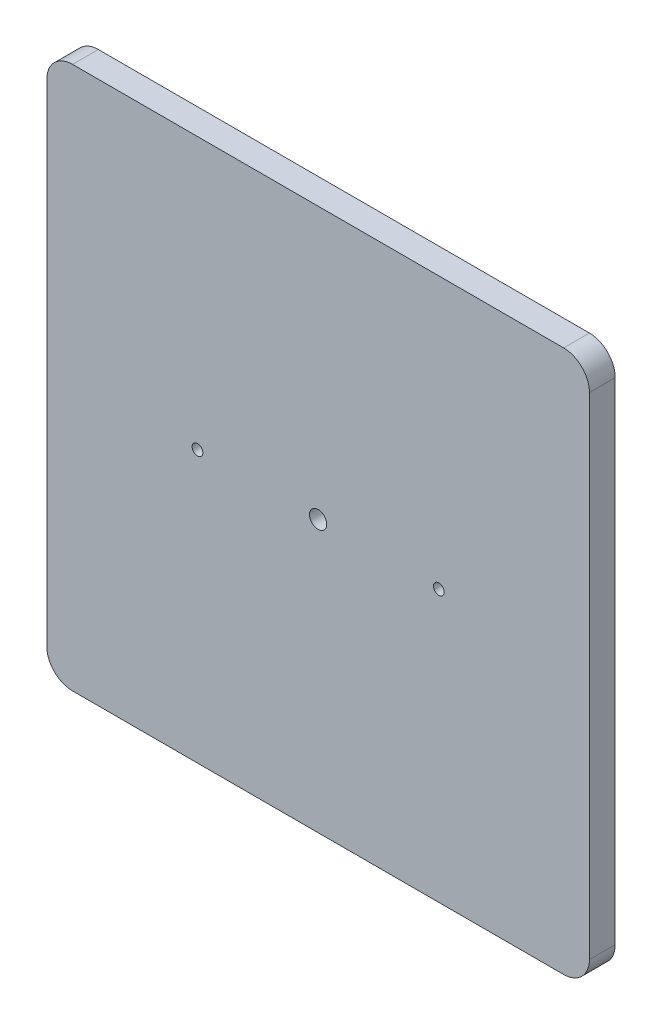
ISO-10303-21;
HEADER;
FILE_DESCRIPTION(('STEP AP214'),'2;1');
FILE_NAME('part.step','',(''),(''),'','','');
FILE_SCHEMA(('AUTOMOTIVE_DESIGN { 1 0 10303 214 1 1 1 1 }'));
ENDSEC;
DATA;
#1=APPLICATION_CONTEXT('core data for automotive mechanical design processes');
#2=APPLICATION_PROTOCOL_DEFINITION('international standard','automotive_design',2000,#1);
#3=PRODUCT_CONTEXT('',#1,'mechanical');
#4=PRODUCT('Part','Part','',(#3));
#5=PRODUCT_RELATED_PRODUCT_CATEGORY('part','',(#4));
#6=PRODUCT_DEFINITION_FORMATION('','',#4);
#7=PRODUCT_DEFINITION_CONTEXT('part definition',#1,'design');
#8=PRODUCT_DEFINITION('design','',#6,#7);
#9=PRODUCT_DEFINITION_SHAPE('','',#8);
#10=(LENGTH_UNIT() NAMED_UNIT(*) SI_UNIT(.MILLI.,.METRE.));
#11=(NAMED_UNIT(*) PLANE_ANGLE_UNIT() SI_UNIT($,.RADIAN.));
#12=(NAMED_UNIT(*) SI_UNIT($,.STERADIAN.) SOLID_ANGLE_UNIT());
#13=UNCERTAINTY_MEASURE_WITH_UNIT(LENGTH_MEASURE(1.E-05),#10,'distance_accuracy_value','');
#14=(GEOMETRIC_REPRESENTATION_CONTEXT(3) GLOBAL_UNCERTAINTY_ASSIGNED_CONTEXT((#13)) GLOBAL_UNIT_ASSIGNED_CONTEXT((#10,
#11,#12)) REPRESENTATION_CONTEXT('',''));
#15=CARTESIAN_POINT('',(0.,0.,0.));
#16=DIRECTION('',(0.,0.,1.));
#17=DIRECTION('',(1.,0.,0.));
#18=AXIS2_PLACEMENT_3D('',#15,#16,#17);
#19=CARTESIAN_POINT('',(0.,0.,0.));
#20=DIRECTION('',(0.,0.,1.));
#21=DIRECTION('',(1.,0.,0.));
#22=AXIS2_PLACEMENT_3D('',#19,#20,#21);
#23=PLANE('',#22);
#24=CARTESIAN_POINT('',(44.5,0.,0.));
#25=DIRECTION('',(0.,0.,-1.));
#26=DIRECTION('',(-1.,0.,0.));
#27=AXIS2_PLACEMENT_3D('',#24,#25,#26);
#28=CIRCLE('',#27,2.619375);
#29=CARTESIAN_POINT('',(41.880625,0.,0.));
#30=VERTEX_POINT('',#29);
#31=EDGE_CURVE('E206',#30,#30,#28,.T.);
#32=ORIENTED_EDGE('',*,*,#31,.F.);
#33=EDGE_LOOP('',(#32));
#34=FACE_BOUND('',#33,.T.);
#35=CARTESIAN_POINT('',(0.,0.,0.));
#36=DIRECTION('',(0.,0.,-1.));
#37=DIRECTION('',(-1.,0.,0.));
#38=AXIS2_PLACEMENT_3D('',#35,#36,#37);
#39=CIRCLE('',#38,3.81);
#40=CARTESIAN_POINT('',(-3.81,0.,0.));
#41=VERTEX_POINT('',#40);
#42=EDGE_CURVE('E188',#41,#41,#39,.T.);
#43=ORIENTED_EDGE('',*,*,#42,.F.);
#44=EDGE_LOOP('',(#43));
#45=FACE_BOUND('',#44,.T.);
#46=DIRECTION('',(1.,0.,0.));
#47=VECTOR('',#46,1.);
#48=CARTESIAN_POINT('',(-100.,-100.,0.));
#49=LINE('',#48,#47);
#50=CARTESIAN_POINT('',(-90.5,-100.,0.));
#51=VERTEX_POINT('',#50);
#52=CARTESIAN_POINT('',(90.5,-100.,0.));
#53=VERTEX_POINT('',#52);
#54=EDGE_CURVE('E128',#51,#53,#49,.T.);
#55=ORIENTED_EDGE('',*,*,#54,.F.);
#56=CARTESIAN_POINT('',(-90.5,-90.5,0.));
#57=DIRECTION('',(0.,0.,1.));
#58=DIRECTION('',(1.,0.,0.));
#59=AXIS2_PLACEMENT_3D('',#56,#57,#58);
#60=CIRCLE('',#59,9.5);
#61=CARTESIAN_POINT('',(-100.,-90.5,0.));
#62=VERTEX_POINT('',#61);
#63=EDGE_CURVE('E111',#51,#62,#60,.F.);
#64=ORIENTED_EDGE('',*,*,#63,.T.);
#65=DIRECTION('',(0.,-1.,0.));
#66=VECTOR('',#65,1.);
#67=CARTESIAN_POINT('',(-100.,100.,0.));
#68=LINE('',#67,#66);
#69=CARTESIAN_POINT('',(-100.,90.5,0.));
#70=VERTEX_POINT('',#69);
#71=EDGE_CURVE('E138',#70,#62,#68,.T.);
#72=ORIENTED_EDGE('',*,*,#71,.F.);
#73=CARTESIAN_POINT('',(-90.5,90.5,0.));
#74=DIRECTION('',(0.,0.,1.));
#75=DIRECTION('',(1.,0.,0.));
#76=AXIS2_PLACEMENT_3D('',#73,#74,#75);
#77=CIRCLE('',#76,9.5);
#78=CARTESIAN_POINT('',(-90.5,100.,0.));
#79=VERTEX_POINT('',#78);
#80=EDGE_CURVE('E132',#70,#79,#77,.F.);
#81=ORIENTED_EDGE('',*,*,#80,.T.);
#82=DIRECTION('',(-1.,0.,0.));
#83=VECTOR('',#82,1.);
#84=CARTESIAN_POINT('',(-100.,100.,0.));
#85=LINE('',#84,#83);
#86=CARTESIAN_POINT('',(90.5,100.,0.));
#87=VERTEX_POINT('',#86);
#88=EDGE_CURVE('E142',#87,#79,#85,.T.);
#89=ORIENTED_EDGE('',*,*,#88,.F.);
#90=CARTESIAN_POINT('',(90.5,90.5,0.));
#91=DIRECTION('',(0.,0.,1.));
#92=DIRECTION('',(1.,0.,0.));
#93=AXIS2_PLACEMENT_3D('',#90,#91,#92);
#94=CIRCLE('',#93,9.5);
#95=CARTESIAN_POINT('',(100.,90.5,0.));
#96=VERTEX_POINT('',#95);
#97=EDGE_CURVE('E148',#87,#96,#94,.F.);
#98=ORIENTED_EDGE('',*,*,#97,.T.);
#99=DIRECTION('',(0.,1.,0.));
#100=VECTOR('',#99,1.);
#101=CARTESIAN_POINT('',(100.,100.,0.));
#102=LINE('',#101,#100);
#103=CARTESIAN_POINT('',(100.,-90.5,0.));
#104=VERTEX_POINT('',#103);
#105=EDGE_CURVE('E170',#104,#96,#102,.T.);
#106=ORIENTED_EDGE('',*,*,#105,.F.);
#107=CARTESIAN_POINT('',(90.5,-90.5,0.));
#108=DIRECTION('',(0.,0.,1.));
#109=DIRECTION('',(1.,0.,0.));
#110=AXIS2_PLACEMENT_3D('',#107,#108,#109);
#111=CIRCLE('',#110,9.5);
#112=EDGE_CURVE('E122',#104,#53,#111,.F.);
#113=ORIENTED_EDGE('',*,*,#112,.T.);
#114=EDGE_LOOP('',(#55,#64,#72,#81,#89,#98,#106,#113));
#115=FACE_BOUND('',#114,.T.);
#116=CARTESIAN_POINT('',(-44.45,0.,0.));
#117=DIRECTION('',(0.,0.,-1.));
#118=DIRECTION('',(-1.,0.,0.));
#119=AXIS2_PLACEMENT_3D('',#116,#117,#118);
#120=CIRCLE('',#119,2.619375);
#121=CARTESIAN_POINT('',(-47.069375,0.,0.));
#122=VERTEX_POINT('',#121);
#123=EDGE_CURVE('E197',#122,#122,#120,.T.);
#124=ORIENTED_EDGE('',*,*,#123,.F.);
#125=EDGE_LOOP('',(#124));
#126=FACE_BOUND('',#125,.T.);
#127=ADVANCED_FACE('F45',(#34,#45,#115,#126),#23,.F.);
#128=CARTESIAN_POINT('',(100.,100.,9.5));
#129=DIRECTION('',(-1.,0.,0.));
#130=DIRECTION('',(0.,-1.,0.));
#131=AXIS2_PLACEMENT_3D('',#128,#129,#130);
#132=PLANE('',#131);
#133=DIRECTION('',(0.,1.,0.));
#134=VECTOR('',#133,1.);
#135=CARTESIAN_POINT('',(100.,100.,9.5));
#136=LINE('',#135,#134);
#137=CARTESIAN_POINT('',(100.,-90.5,9.5));
#138=VERTEX_POINT('',#137);
#139=CARTESIAN_POINT('',(100.,90.5,9.5));
#140=VERTEX_POINT('',#139);
#141=EDGE_CURVE('E137',#138,#140,#136,.T.);
#142=ORIENTED_EDGE('',*,*,#141,.F.);
#143=DIRECTION('',(0.,0.,-1.));
#144=VECTOR('',#143,1.);
#145=CARTESIAN_POINT('',(100.,-90.5,9.5));
#146=LINE('',#145,#144);
#147=EDGE_CURVE('E163',#138,#104,#146,.T.);
#148=ORIENTED_EDGE('',*,*,#147,.T.);
#149=ORIENTED_EDGE('',*,*,#105,.T.);
#150=DIRECTION('',(0.,0.,-1.));
#151=VECTOR('',#150,1.);
#152=CARTESIAN_POINT('',(100.,90.5,9.5));
#153=LINE('',#152,#151);
#154=EDGE_CURVE('E161',#96,#140,#153,.F.);
#155=ORIENTED_EDGE('',*,*,#154,.T.);
#156=EDGE_LOOP('',(#142,#148,#149,#155));
#157=FACE_BOUND('',#156,.T.);
#158=ADVANCED_FACE('F169',(#157),#132,.F.);
#159=CARTESIAN_POINT('',(-100.,100.,9.5));
#160=DIRECTION('',(0.,-1.,0.));
#161=DIRECTION('',(0.,0.,-1.));
#162=AXIS2_PLACEMENT_3D('',#159,#160,#161);
#163=PLANE('',#162);
#164=DIRECTION('',(-1.,0.,0.));
#165=VECTOR('',#164,1.);
#166=CARTESIAN_POINT('',(-100.,100.,9.5));
#167=LINE('',#166,#165);
#168=CARTESIAN_POINT('',(90.5,100.,9.5));
#169=VERTEX_POINT('',#168);
#170=CARTESIAN_POINT('',(-90.5,100.,9.5));
#171=VERTEX_POINT('',#170);
#172=EDGE_CURVE('E140',#169,#171,#167,.T.);
#173=ORIENTED_EDGE('',*,*,#172,.F.);
#174=DIRECTION('',(0.,0.,-1.));
#175=VECTOR('',#174,1.);
#176=CARTESIAN_POINT('',(90.5,100.,9.5));
#177=LINE('',#176,#175);
#178=EDGE_CURVE('E11',#169,#87,#177,.T.);
#179=ORIENTED_EDGE('',*,*,#178,.T.);
#180=ORIENTED_EDGE('',*,*,#88,.T.);
#181=DIRECTION('',(0.,0.,-1.));
#182=VECTOR('',#181,1.);
#183=CARTESIAN_POINT('',(-90.5,100.,9.5));
#184=LINE('',#183,#182);
#185=EDGE_CURVE('E53',#79,#171,#184,.F.);
#186=ORIENTED_EDGE('',*,*,#185,.T.);
#187=EDGE_LOOP('',(#173,#179,#180,#186));
#188=FACE_BOUND('',#187,.T.);
#189=ADVANCED_FACE('F244',(#188),#163,.F.);
#190=CARTESIAN_POINT('',(-100.,100.,9.5));
#191=DIRECTION('',(1.,0.,0.));
#192=DIRECTION('',(0.,1.,0.));
#193=AXIS2_PLACEMENT_3D('',#190,#191,#192);
#194=PLANE('',#193);
#195=ORIENTED_EDGE('',*,*,#71,.T.);
#196=DIRECTION('',(0.,0.,-1.));
#197=VECTOR('',#196,1.);
#198=CARTESIAN_POINT('',(-100.,-90.5,9.5));
#199=LINE('',#198,#197);
#200=CARTESIAN_POINT('',(-100.,-90.5,9.5));
#201=VERTEX_POINT('',#200);
#202=EDGE_CURVE('E116',#62,#201,#199,.F.);
#203=ORIENTED_EDGE('',*,*,#202,.T.);
#204=DIRECTION('',(0.,-1.,0.));
#205=VECTOR('',#204,1.);
#206=CARTESIAN_POINT('',(-100.,100.,9.5));
#207=LINE('',#206,#205);
#208=CARTESIAN_POINT('',(-100.,90.5,9.5));
#209=VERTEX_POINT('',#208);
#210=EDGE_CURVE('E182',#209,#201,#207,.T.);
#211=ORIENTED_EDGE('',*,*,#210,.F.);
#212=DIRECTION('',(0.,0.,-1.));
#213=VECTOR('',#212,1.);
#214=CARTESIAN_POINT('',(-100.,90.5,9.5));
#215=LINE('',#214,#213);
#216=EDGE_CURVE('E121',#209,#70,#215,.T.);
#217=ORIENTED_EDGE('',*,*,#216,.T.);
#218=EDGE_LOOP('',(#195,#203,#211,#217));
#219=FACE_BOUND('',#218,.T.);
#220=ADVANCED_FACE('F241',(#219),#194,.F.);
#221=CARTESIAN_POINT('',(-100.,-100.,9.5));
#222=DIRECTION('',(0.,1.,0.));
#223=DIRECTION('',(0.,0.,1.));
#224=AXIS2_PLACEMENT_3D('',#221,#222,#223);
#225=PLANE('',#224);
#226=DIRECTION('',(1.,0.,0.));
#227=VECTOR('',#226,1.);
#228=CARTESIAN_POINT('',(-100.,-100.,9.5));
#229=LINE('',#228,#227);
#230=CARTESIAN_POINT('',(-90.5,-100.,9.5));
#231=VERTEX_POINT('',#230);
#232=CARTESIAN_POINT('',(90.5,-100.,9.5));
#233=VERTEX_POINT('',#232);
#234=EDGE_CURVE('E131',#231,#233,#229,.T.);
#235=ORIENTED_EDGE('',*,*,#234,.F.);
#236=DIRECTION('',(0.,0.,-1.));
#237=VECTOR('',#236,1.);
#238=CARTESIAN_POINT('',(-90.5,-100.,9.5));
#239=LINE('',#238,#237);
#240=EDGE_CURVE('E115',#231,#51,#239,.T.);
#241=ORIENTED_EDGE('',*,*,#240,.T.);
#242=ORIENTED_EDGE('',*,*,#54,.T.);
#243=DIRECTION('',(0.,0.,-1.));
#244=VECTOR('',#243,1.);
#245=CARTESIAN_POINT('',(90.5,-100.,9.5));
#246=LINE('',#245,#244);
#247=EDGE_CURVE('E133',#53,#233,#246,.F.);
#248=ORIENTED_EDGE('',*,*,#247,.T.);
#249=EDGE_LOOP('',(#235,#241,#242,#248));
#250=FACE_BOUND('',#249,.T.);
#251=ADVANCED_FACE('F127',(#250),#225,.F.);
#252=CARTESIAN_POINT('',(0.,0.,9.5));
#253=DIRECTION('',(0.,0.,1.));
#254=DIRECTION('',(1.,0.,0.));
#255=AXIS2_PLACEMENT_3D('',#252,#253,#254);
#256=PLANE('',#255);
#257=CARTESIAN_POINT('',(44.5,0.,9.5));
#258=DIRECTION('',(0.,0.,-1.));
#259=DIRECTION('',(-1.,0.,0.));
#260=AXIS2_PLACEMENT_3D('',#257,#258,#259);
#261=CIRCLE('',#260,1.984375);
#262=CARTESIAN_POINT('',(42.515625,0.,9.5));
#263=VERTEX_POINT('',#262);
#264=EDGE_CURVE('E200',#263,#263,#261,.T.);
#265=ORIENTED_EDGE('',*,*,#264,.T.);
#266=EDGE_LOOP('',(#265));
#267=FACE_BOUND('',#266,.T.);
#268=CARTESIAN_POINT('',(-44.45,0.,9.5));
#269=DIRECTION('',(0.,0.,-1.));
#270=DIRECTION('',(-1.,0.,0.));
#271=AXIS2_PLACEMENT_3D('',#268,#269,#270);
#272=CIRCLE('',#271,1.984375);
#273=CARTESIAN_POINT('',(-46.434375,0.,9.5));
#274=VERTEX_POINT('',#273);
#275=EDGE_CURVE('E191',#274,#274,#272,.T.);
#276=ORIENTED_EDGE('',*,*,#275,.T.);
#277=EDGE_LOOP('',(#276));
#278=FACE_BOUND('',#277,.T.);
#279=CARTESIAN_POINT('',(0.,0.,9.5));
#280=DIRECTION('',(0.,0.,-1.));
#281=DIRECTION('',(-1.,0.,0.));
#282=AXIS2_PLACEMENT_3D('',#279,#280,#281);
#283=CIRCLE('',#282,3.175);
#284=CARTESIAN_POINT('',(-3.175,0.,9.5));
#285=VERTEX_POINT('',#284);
#286=EDGE_CURVE('E175',#285,#285,#283,.T.);
#287=ORIENTED_EDGE('',*,*,#286,.T.);
#288=EDGE_LOOP('',(#287));
#289=FACE_BOUND('',#288,.T.);
#290=ORIENTED_EDGE('',*,*,#210,.T.);
#291=CARTESIAN_POINT('',(-90.5,-90.5,9.5));
#292=DIRECTION('',(0.,0.,1.));
#293=DIRECTION('',(1.,0.,0.));
#294=AXIS2_PLACEMENT_3D('',#291,#292,#293);
#295=CIRCLE('',#294,9.5);
#296=EDGE_CURVE('E159',#201,#231,#295,.T.);
#297=ORIENTED_EDGE('',*,*,#296,.T.);
#298=ORIENTED_EDGE('',*,*,#234,.T.);
#299=CARTESIAN_POINT('',(90.5,-90.5,9.5));
#300=DIRECTION('',(0.,0.,1.));
#301=DIRECTION('',(1.,0.,0.));
#302=AXIS2_PLACEMENT_3D('',#299,#300,#301);
#303=CIRCLE('',#302,9.5);
#304=EDGE_CURVE('E157',#233,#138,#303,.T.);
#305=ORIENTED_EDGE('',*,*,#304,.T.);
#306=ORIENTED_EDGE('',*,*,#141,.T.);
#307=CARTESIAN_POINT('',(90.5,90.5,9.5));
#308=DIRECTION('',(0.,0.,1.));
#309=DIRECTION('',(1.,0.,0.));
#310=AXIS2_PLACEMENT_3D('',#307,#308,#309);
#311=CIRCLE('',#310,9.5);
#312=EDGE_CURVE('E66',#140,#169,#311,.T.);
#313=ORIENTED_EDGE('',*,*,#312,.T.);
#314=ORIENTED_EDGE('',*,*,#172,.T.);
#315=CARTESIAN_POINT('',(-90.5,90.5,9.5));
#316=DIRECTION('',(0.,0.,1.));
#317=DIRECTION('',(1.,0.,0.));
#318=AXIS2_PLACEMENT_3D('',#315,#316,#317);
#319=CIRCLE('',#318,9.5);
#320=EDGE_CURVE('E154',#171,#209,#319,.T.);
#321=ORIENTED_EDGE('',*,*,#320,.T.);
#322=EDGE_LOOP('',(#290,#297,#298,#305,#306,#313,#314,#321));
#323=FACE_BOUND('',#322,.T.);
#324=ADVANCED_FACE('F235',(#267,#278,#289,#323),#256,.T.);
#325=CARTESIAN_POINT('',(-90.5,-90.5,9.5));
#326=DIRECTION('',(0.,0.,-1.));
#327=DIRECTION('',(-1.,0.,0.));
#328=AXIS2_PLACEMENT_3D('',#325,#326,#327);
#329=CYLINDRICAL_SURFACE('',#328,9.5);
#330=ORIENTED_EDGE('',*,*,#296,.F.);
#331=ORIENTED_EDGE('',*,*,#202,.F.);
#332=ORIENTED_EDGE('',*,*,#63,.F.);
#333=ORIENTED_EDGE('',*,*,#240,.F.);
#334=EDGE_LOOP('',(#330,#331,#332,#333));
#335=FACE_BOUND('',#334,.T.);
#336=ADVANCED_FACE('F114',(#335),#329,.T.);
#337=CARTESIAN_POINT('',(90.5,-90.5,9.5));
#338=DIRECTION('',(0.,0.,-1.));
#339=DIRECTION('',(-1.,0.,0.));
#340=AXIS2_PLACEMENT_3D('',#337,#338,#339);
#341=CYLINDRICAL_SURFACE('',#340,9.5);
#342=ORIENTED_EDGE('',*,*,#304,.F.);
#343=ORIENTED_EDGE('',*,*,#247,.F.);
#344=ORIENTED_EDGE('',*,*,#112,.F.);
#345=ORIENTED_EDGE('',*,*,#147,.F.);
#346=EDGE_LOOP('',(#342,#343,#344,#345));
#347=FACE_BOUND('',#346,.T.);
#348=ADVANCED_FACE('F252',(#347),#341,.T.);
#349=CARTESIAN_POINT('',(90.5,90.5,9.5));
#350=DIRECTION('',(0.,0.,-1.));
#351=DIRECTION('',(-1.,0.,0.));
#352=AXIS2_PLACEMENT_3D('',#349,#350,#351);
#353=CYLINDRICAL_SURFACE('',#352,9.5);
#354=ORIENTED_EDGE('',*,*,#312,.F.);
#355=ORIENTED_EDGE('',*,*,#154,.F.);
#356=ORIENTED_EDGE('',*,*,#97,.F.);
#357=ORIENTED_EDGE('',*,*,#178,.F.);
#358=EDGE_LOOP('',(#354,#355,#356,#357));
#359=FACE_BOUND('',#358,.T.);
#360=ADVANCED_FACE('F254',(#359),#353,.T.);
#361=CARTESIAN_POINT('',(-90.5,90.5,9.5));
#362=DIRECTION('',(0.,0.,-1.));
#363=DIRECTION('',(-1.,0.,0.));
#364=AXIS2_PLACEMENT_3D('',#361,#362,#363);
#365=CYLINDRICAL_SURFACE('',#364,9.5);
#366=ORIENTED_EDGE('',*,*,#320,.F.);
#367=ORIENTED_EDGE('',*,*,#185,.F.);
#368=ORIENTED_EDGE('',*,*,#80,.F.);
#369=ORIENTED_EDGE('',*,*,#216,.F.);
#370=EDGE_LOOP('',(#366,#367,#368,#369));
#371=FACE_BOUND('',#370,.T.);
#372=ADVANCED_FACE('F47',(#371),#365,.T.);
#373=CARTESIAN_POINT('',(0.,0.,0.));
#374=DIRECTION('',(0.,0.,-1.));
#375=DIRECTION('',(-1.,0.,0.));
#376=AXIS2_PLACEMENT_3D('',#373,#374,#375);
#377=CYLINDRICAL_SURFACE('',#376,3.175);
#378=ORIENTED_EDGE('',*,*,#286,.F.);
#379=EDGE_LOOP('',(#378));
#380=FACE_BOUND('',#379,.T.);
#381=CARTESIAN_POINT('',(0.,0.,0.634999999999999));
#382=DIRECTION('',(0.,0.,-1.));
#383=DIRECTION('',(-1.,0.,0.));
#384=AXIS2_PLACEMENT_3D('',#381,#382,#383);
#385=CIRCLE('',#384,3.175);
#386=CARTESIAN_POINT('',(-3.175,0.,0.634999999999999));
#387=VERTEX_POINT('',#386);
#388=EDGE_CURVE('E178',#387,#387,#385,.T.);
#389=ORIENTED_EDGE('',*,*,#388,.T.);
#390=EDGE_LOOP('',(#389));
#391=FACE_BOUND('',#390,.T.);
#392=ADVANCED_FACE('F220',(#380,#391),#377,.F.);
#393=CARTESIAN_POINT('',(0.,0.,0.));
#394=DIRECTION('',(0.,0.,-1.));
#395=DIRECTION('',(-1.,0.,0.));
#396=AXIS2_PLACEMENT_3D('',#393,#394,#395);
#397=CONICAL_SURFACE('',#396,3.81,0.785398163397449);
#398=ORIENTED_EDGE('',*,*,#388,.F.);
#399=EDGE_LOOP('',(#398));
#400=FACE_BOUND('',#399,.T.);
#401=ORIENTED_EDGE('',*,*,#42,.T.);
#402=EDGE_LOOP('',(#401));
#403=FACE_BOUND('',#402,.T.);
#404=ADVANCED_FACE('F217',(#400,#403),#397,.F.);
#405=CARTESIAN_POINT('',(-44.45,0.,0.));
#406=DIRECTION('',(0.,0.,-1.));
#407=DIRECTION('',(-1.,0.,0.));
#408=AXIS2_PLACEMENT_3D('',#405,#406,#407);
#409=CYLINDRICAL_SURFACE('',#408,1.984375);
#410=ORIENTED_EDGE('',*,*,#275,.F.);
#411=EDGE_LOOP('',(#410));
#412=FACE_BOUND('',#411,.T.);
#413=CARTESIAN_POINT('',(-44.45,0.,0.532828265797572));
#414=DIRECTION('',(0.,0.,-1.));
#415=DIRECTION('',(-1.,0.,0.));
#416=AXIS2_PLACEMENT_3D('',#413,#414,#415);
#417=CIRCLE('',#416,1.984375);
#418=CARTESIAN_POINT('',(-46.434375,0.,0.532828265797572));
#419=VERTEX_POINT('',#418);
#420=EDGE_CURVE('E194',#419,#419,#417,.T.);
#421=ORIENTED_EDGE('',*,*,#420,.T.);
#422=EDGE_LOOP('',(#421));
#423=FACE_BOUND('',#422,.T.);
#424=ADVANCED_FACE('F219',(#412,#423),#409,.F.);
#425=CARTESIAN_POINT('',(-44.45,0.,0.));
#426=DIRECTION('',(0.,0.,-1.));
#427=DIRECTION('',(-1.,0.,0.));
#428=AXIS2_PLACEMENT_3D('',#425,#426,#427);
#429=CONICAL_SURFACE('',#428,2.619375,0.872664625997168);
#430=ORIENTED_EDGE('',*,*,#420,.F.);
#431=EDGE_LOOP('',(#430));
#432=FACE_BOUND('',#431,.T.);
#433=ORIENTED_EDGE('',*,*,#123,.T.);
#434=EDGE_LOOP('',(#433));
#435=FACE_BOUND('',#434,.T.);
#436=ADVANCED_FACE('F227',(#432,#435),#429,.F.);
#437=CARTESIAN_POINT('',(44.5,0.,0.));
#438=DIRECTION('',(0.,0.,-1.));
#439=DIRECTION('',(-1.,0.,0.));
#440=AXIS2_PLACEMENT_3D('',#437,#438,#439);
#441=CYLINDRICAL_SURFACE('',#440,1.984375);
#442=ORIENTED_EDGE('',*,*,#264,.F.);
#443=EDGE_LOOP('',(#442));
#444=FACE_BOUND('',#443,.T.);
#445=CARTESIAN_POINT('',(44.5,0.,0.532828265797572));
#446=DIRECTION('',(0.,0.,-1.));
#447=DIRECTION('',(-1.,0.,0.));
#448=AXIS2_PLACEMENT_3D('',#445,#446,#447);
#449=CIRCLE('',#448,1.984375);
#450=CARTESIAN_POINT('',(42.515625,0.,0.532828265797572));
#451=VERTEX_POINT('',#450);
#452=EDGE_CURVE('E203',#451,#451,#449,.T.);
#453=ORIENTED_EDGE('',*,*,#452,.T.);
#454=EDGE_LOOP('',(#453));
#455=FACE_BOUND('',#454,.T.);
#456=ADVANCED_FACE('F297',(#444,#455),#441,.F.);
#457=CARTESIAN_POINT('',(44.5,0.,0.));
#458=DIRECTION('',(0.,0.,-1.));
#459=DIRECTION('',(-1.,0.,0.));
#460=AXIS2_PLACEMENT_3D('',#457,#458,#459);
#461=CONICAL_SURFACE('',#460,2.619375,0.872664625997168);
#462=ORIENTED_EDGE('',*,*,#452,.F.);
#463=EDGE_LOOP('',(#462));
#464=FACE_BOUND('',#463,.T.);
#465=ORIENTED_EDGE('',*,*,#31,.T.);
#466=EDGE_LOOP('',(#465));
#467=FACE_BOUND('',#466,.T.);
#468=ADVANCED_FACE('F210',(#464,#467),#461,.F.);
#469=CLOSED_SHELL('',(#127,#158,#189,#220,#251,#324,#336,#348,#360,#372,#392,#404,#424,#436,
#456,#468));
#470=MANIFOLD_SOLID_BREP('B2',#469);
#471=ADVANCED_BREP_SHAPE_REPRESENTATION('',(#18,#470),#14);
#472=SHAPE_DEFINITION_REPRESENTATION(#9,#471);
ENDSEC;
END-ISO-10303-21;
